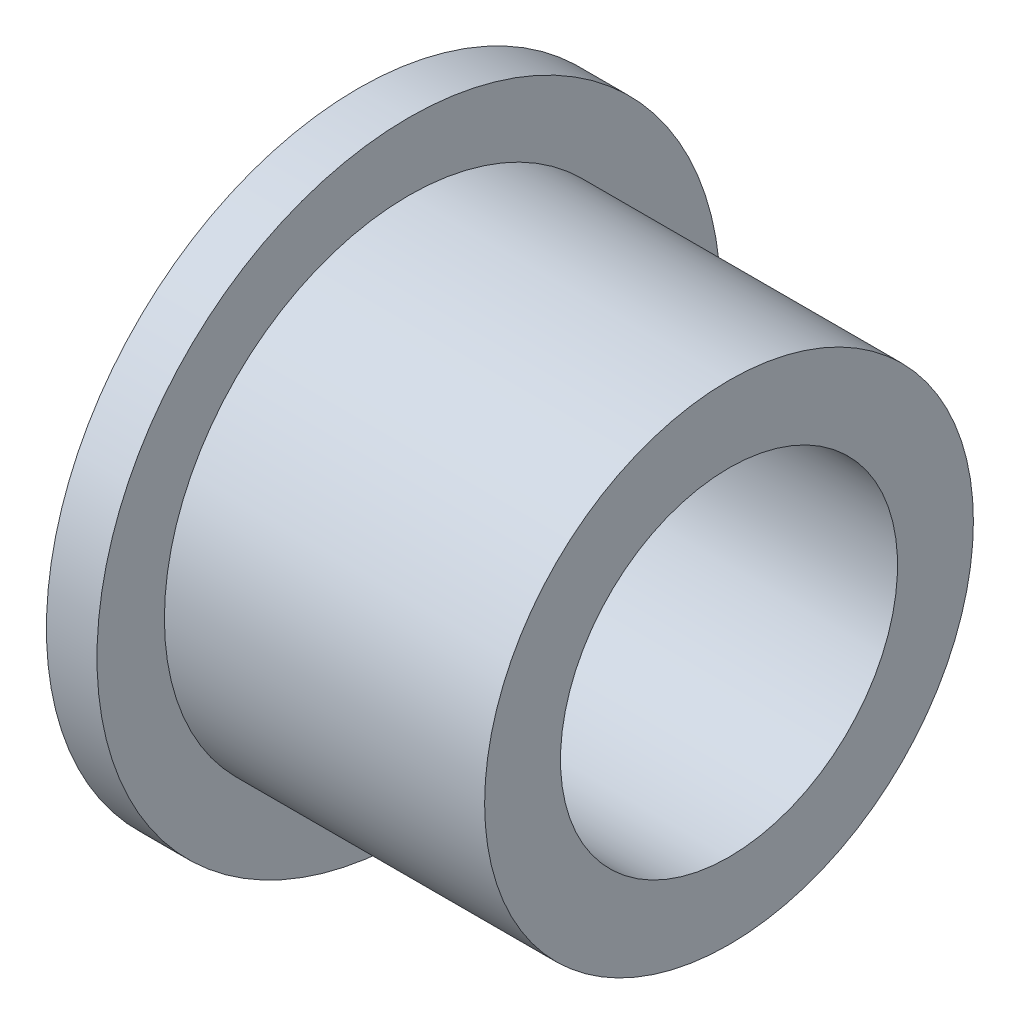
ISO-10303-21;
HEADER;
FILE_DESCRIPTION(('STEP AP214'),'2;1');
FILE_NAME('part.step','',(''),(''),'','','');
FILE_SCHEMA(('AUTOMOTIVE_DESIGN { 1 0 10303 214 1 1 1 1 }'));
ENDSEC;
DATA;
#1=APPLICATION_CONTEXT('core data for automotive mechanical design processes');
#2=APPLICATION_PROTOCOL_DEFINITION('international standard','automotive_design',2000,#1);
#3=PRODUCT_CONTEXT('',#1,'mechanical');
#4=PRODUCT('Part','Part','',(#3));
#5=PRODUCT_RELATED_PRODUCT_CATEGORY('part','',(#4));
#6=PRODUCT_DEFINITION_FORMATION('','',#4);
#7=PRODUCT_DEFINITION_CONTEXT('part definition',#1,'design');
#8=PRODUCT_DEFINITION('design','',#6,#7);
#9=PRODUCT_DEFINITION_SHAPE('','',#8);
#10=(LENGTH_UNIT() NAMED_UNIT(*) SI_UNIT(.MILLI.,.METRE.));
#11=(NAMED_UNIT(*) PLANE_ANGLE_UNIT() SI_UNIT($,.RADIAN.));
#12=(NAMED_UNIT(*) SI_UNIT($,.STERADIAN.) SOLID_ANGLE_UNIT());
#13=UNCERTAINTY_MEASURE_WITH_UNIT(LENGTH_MEASURE(1.E-05),#10,'distance_accuracy_value','');
#14=(GEOMETRIC_REPRESENTATION_CONTEXT(3) GLOBAL_UNCERTAINTY_ASSIGNED_CONTEXT((#13)) GLOBAL_UNIT_ASSIGNED_CONTEXT((#10,
#11,#12)) REPRESENTATION_CONTEXT('',''));
#15=CARTESIAN_POINT('',(0.,0.,0.));
#16=DIRECTION('',(0.,0.,1.));
#17=DIRECTION('',(1.,0.,0.));
#18=AXIS2_PLACEMENT_3D('',#15,#16,#17);
#19=CARTESIAN_POINT('',(0.,0.,0.));
#20=DIRECTION('',(-1.,0.,0.));
#21=DIRECTION('',(0.,-1.,0.));
#22=AXIS2_PLACEMENT_3D('',#19,#20,#21);
#23=CYLINDRICAL_SURFACE('',#22,18.5);
#24=CARTESIAN_POINT('',(0.,0.,0.));
#25=DIRECTION('',(-1.,0.,0.));
#26=DIRECTION('',(0.,-1.,0.));
#27=AXIS2_PLACEMENT_3D('',#24,#25,#26);
#28=CIRCLE('',#27,18.5);
#29=CARTESIAN_POINT('',(0.,-18.5,0.));
#30=VERTEX_POINT('',#29);
#31=EDGE_CURVE('E52',#30,#30,#28,.T.);
#32=ORIENTED_EDGE('',*,*,#31,.F.);
#33=EDGE_LOOP('',(#32));
#34=FACE_BOUND('',#33,.T.);
#35=CARTESIAN_POINT('',(3.,0.,0.));
#36=DIRECTION('',(-1.,0.,0.));
#37=DIRECTION('',(0.,-1.,0.));
#38=AXIS2_PLACEMENT_3D('',#35,#36,#37);
#39=CIRCLE('',#38,18.5);
#40=CARTESIAN_POINT('',(3.,-18.5,0.));
#41=VERTEX_POINT('',#40);
#42=EDGE_CURVE('E10',#41,#41,#39,.T.);
#43=ORIENTED_EDGE('',*,*,#42,.T.);
#44=EDGE_LOOP('',(#43));
#45=FACE_BOUND('',#44,.T.);
#46=ADVANCED_FACE('F30',(#34,#45),#23,.T.);
#47=CARTESIAN_POINT('',(3.,18.5,0.));
#48=DIRECTION('',(-1.,0.,0.));
#49=DIRECTION('',(0.,-1.,0.));
#50=AXIS2_PLACEMENT_3D('',#47,#48,#49);
#51=PLANE('',#50);
#52=ORIENTED_EDGE('',*,*,#42,.F.);
#53=EDGE_LOOP('',(#52));
#54=FACE_BOUND('',#53,.T.);
#55=CARTESIAN_POINT('',(3.,0.,0.));
#56=DIRECTION('',(-1.,0.,0.));
#57=DIRECTION('',(0.,-1.,0.));
#58=AXIS2_PLACEMENT_3D('',#55,#56,#57);
#59=CIRCLE('',#58,14.5);
#60=CARTESIAN_POINT('',(3.,-14.5,0.));
#61=VERTEX_POINT('',#60);
#62=EDGE_CURVE('E36',#61,#61,#59,.T.);
#63=ORIENTED_EDGE('',*,*,#62,.T.);
#64=EDGE_LOOP('',(#63));
#65=FACE_BOUND('',#64,.T.);
#66=ADVANCED_FACE('F59',(#54,#65),#51,.F.);
#67=CARTESIAN_POINT('',(0.,0.,0.));
#68=DIRECTION('',(-1.,0.,0.));
#69=DIRECTION('',(0.,-1.,0.));
#70=AXIS2_PLACEMENT_3D('',#67,#68,#69);
#71=CYLINDRICAL_SURFACE('',#70,14.5);
#72=ORIENTED_EDGE('',*,*,#62,.F.);
#73=EDGE_LOOP('',(#72));
#74=FACE_BOUND('',#73,.T.);
#75=CARTESIAN_POINT('',(22.,0.,0.));
#76=DIRECTION('',(-1.,0.,0.));
#77=DIRECTION('',(0.,-1.,0.));
#78=AXIS2_PLACEMENT_3D('',#75,#76,#77);
#79=CIRCLE('',#78,14.5);
#80=CARTESIAN_POINT('',(22.,-14.5,0.));
#81=VERTEX_POINT('',#80);
#82=EDGE_CURVE('E40',#81,#81,#79,.T.);
#83=ORIENTED_EDGE('',*,*,#82,.T.);
#84=EDGE_LOOP('',(#83));
#85=FACE_BOUND('',#84,.T.);
#86=ADVANCED_FACE('F63',(#74,#85),#71,.T.);
#87=CARTESIAN_POINT('',(22.,14.5,0.));
#88=DIRECTION('',(-1.,0.,0.));
#89=DIRECTION('',(0.,-1.,0.));
#90=AXIS2_PLACEMENT_3D('',#87,#88,#89);
#91=PLANE('',#90);
#92=ORIENTED_EDGE('',*,*,#82,.F.);
#93=EDGE_LOOP('',(#92));
#94=FACE_BOUND('',#93,.T.);
#95=CARTESIAN_POINT('',(22.,0.,0.));
#96=DIRECTION('',(-1.,0.,0.));
#97=DIRECTION('',(0.,-1.,0.));
#98=AXIS2_PLACEMENT_3D('',#95,#96,#97);
#99=CIRCLE('',#98,10.);
#100=CARTESIAN_POINT('',(22.,-10.,0.));
#101=VERTEX_POINT('',#100);
#102=EDGE_CURVE('E44',#101,#101,#99,.T.);
#103=ORIENTED_EDGE('',*,*,#102,.T.);
#104=EDGE_LOOP('',(#103));
#105=FACE_BOUND('',#104,.T.);
#106=ADVANCED_FACE('F68',(#94,#105),#91,.F.);
#107=CARTESIAN_POINT('',(0.,0.,0.));
#108=DIRECTION('',(-1.,0.,0.));
#109=DIRECTION('',(0.,-1.,0.));
#110=AXIS2_PLACEMENT_3D('',#107,#108,#109);
#111=CYLINDRICAL_SURFACE('',#110,10.);
#112=ORIENTED_EDGE('',*,*,#102,.F.);
#113=EDGE_LOOP('',(#112));
#114=FACE_BOUND('',#113,.T.);
#115=CARTESIAN_POINT('',(0.,0.,0.));
#116=DIRECTION('',(-1.,0.,0.));
#117=DIRECTION('',(0.,-1.,0.));
#118=AXIS2_PLACEMENT_3D('',#115,#116,#117);
#119=CIRCLE('',#118,10.);
#120=CARTESIAN_POINT('',(0.,-10.,0.));
#121=VERTEX_POINT('',#120);
#122=EDGE_CURVE('E49',#121,#121,#119,.T.);
#123=ORIENTED_EDGE('',*,*,#122,.T.);
#124=EDGE_LOOP('',(#123));
#125=FACE_BOUND('',#124,.T.);
#126=ADVANCED_FACE('F74',(#114,#125),#111,.F.);
#127=CARTESIAN_POINT('',(0.,10.,0.));
#128=DIRECTION('',(1.,0.,0.));
#129=DIRECTION('',(0.,1.,0.));
#130=AXIS2_PLACEMENT_3D('',#127,#128,#129);
#131=PLANE('',#130);
#132=ORIENTED_EDGE('',*,*,#122,.F.);
#133=EDGE_LOOP('',(#132));
#134=FACE_BOUND('',#133,.T.);
#135=ORIENTED_EDGE('',*,*,#31,.T.);
#136=EDGE_LOOP('',(#135));
#137=FACE_BOUND('',#136,.T.);
#138=ADVANCED_FACE('F56',(#134,#137),#131,.F.);
#139=CLOSED_SHELL('',(#46,#66,#86,#106,#126,#138));
#140=MANIFOLD_SOLID_BREP('B2',#139);
#141=ADVANCED_BREP_SHAPE_REPRESENTATION('',(#18,#140),#14);
#142=SHAPE_DEFINITION_REPRESENTATION(#9,#141);
ENDSEC;
END-ISO-10303-21;
